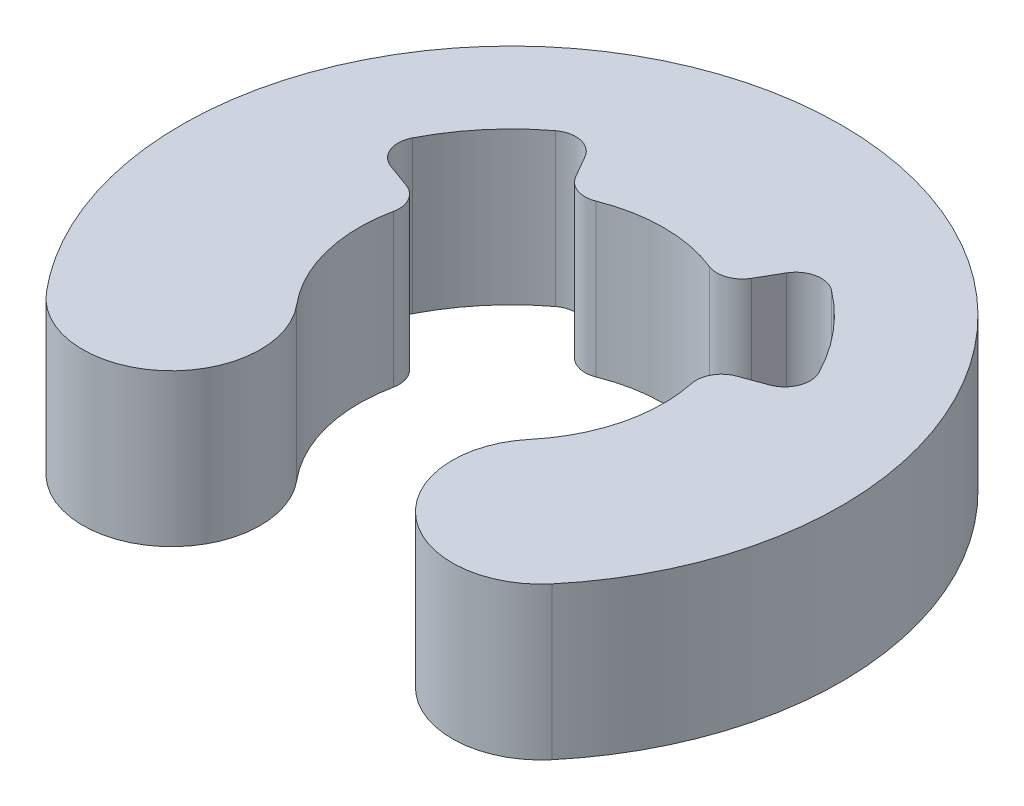
ISO-10303-21;
HEADER;
FILE_DESCRIPTION(('STEP AP214'),'2;1');
FILE_NAME('part.step','',(''),(''),'','','');
FILE_SCHEMA(('AUTOMOTIVE_DESIGN { 1 0 10303 214 1 1 1 1 }'));
ENDSEC;
DATA;
#1=APPLICATION_CONTEXT('core data for automotive mechanical design processes');
#2=APPLICATION_PROTOCOL_DEFINITION('international standard','automotive_design',2000,#1);
#3=PRODUCT_CONTEXT('',#1,'mechanical');
#4=PRODUCT('Part','Part','',(#3));
#5=PRODUCT_RELATED_PRODUCT_CATEGORY('part','',(#4));
#6=PRODUCT_DEFINITION_FORMATION('','',#4);
#7=PRODUCT_DEFINITION_CONTEXT('part definition',#1,'design');
#8=PRODUCT_DEFINITION('design','',#6,#7);
#9=PRODUCT_DEFINITION_SHAPE('','',#8);
#10=(LENGTH_UNIT() NAMED_UNIT(*) SI_UNIT(.MILLI.,.METRE.));
#11=(NAMED_UNIT(*) PLANE_ANGLE_UNIT() SI_UNIT($,.RADIAN.));
#12=(NAMED_UNIT(*) SI_UNIT($,.STERADIAN.) SOLID_ANGLE_UNIT());
#13=UNCERTAINTY_MEASURE_WITH_UNIT(LENGTH_MEASURE(1.E-05),#10,'distance_accuracy_value','');
#14=(GEOMETRIC_REPRESENTATION_CONTEXT(3) GLOBAL_UNCERTAINTY_ASSIGNED_CONTEXT((#13)) GLOBAL_UNIT_ASSIGNED_CONTEXT((#10,
#11,#12)) REPRESENTATION_CONTEXT('',''));
#15=CARTESIAN_POINT('',(0.,0.,0.));
#16=DIRECTION('',(0.,0.,1.));
#17=DIRECTION('',(1.,0.,0.));
#18=AXIS2_PLACEMENT_3D('',#15,#16,#17);
#19=CARTESIAN_POINT('',(3.42620079706036,3.,-0.714946220511138));
#20=DIRECTION('',(0.,-1.,0.));
#21=DIRECTION('',(0.,0.,-1.));
#22=AXIS2_PLACEMENT_3D('',#19,#20,#21);
#23=CYLINDRICAL_SURFACE('',#22,0.5);
#24=CARTESIAN_POINT('',(3.42620079706036,0.,-0.714946220511138));
#25=DIRECTION('',(0.,1.,0.));
#26=DIRECTION('',(0.,0.,1.));
#27=AXIS2_PLACEMENT_3D('',#24,#25,#26);
#28=CIRCLE('',#27,0.5);
#29=CARTESIAN_POINT('',(3.25519072539752,0.,-1.18479253090409));
#30=VERTEX_POINT('',#29);
#31=CARTESIAN_POINT('',(2.93674354033744,0.,-0.612811046152402));
#32=VERTEX_POINT('',#31);
#33=EDGE_CURVE('E211',#30,#32,#28,.T.);
#34=ORIENTED_EDGE('',*,*,#33,.T.);
#35=DIRECTION('',(0.,-1.,0.));
#36=VECTOR('',#35,1.);
#37=CARTESIAN_POINT('',(2.93674354033744,3.,-0.612811046152402));
#38=LINE('',#37,#36);
#39=CARTESIAN_POINT('',(2.93674354033744,3.,-0.612811046152402));
#40=VERTEX_POINT('',#39);
#41=EDGE_CURVE('E11',#40,#32,#38,.T.);
#42=ORIENTED_EDGE('',*,*,#41,.F.);
#43=CARTESIAN_POINT('',(3.42620079706036,3.,-0.714946220511138));
#44=DIRECTION('',(0.,1.,0.));
#45=DIRECTION('',(0.,0.,1.));
#46=AXIS2_PLACEMENT_3D('',#43,#44,#45);
#47=CIRCLE('',#46,0.5);
#48=CARTESIAN_POINT('',(3.25519072539752,3.,-1.18479253090409));
#49=VERTEX_POINT('',#48);
#50=EDGE_CURVE('E249',#49,#40,#47,.T.);
#51=ORIENTED_EDGE('',*,*,#50,.F.);
#52=DIRECTION('',(0.,-1.,0.));
#53=VECTOR('',#52,1.);
#54=CARTESIAN_POINT('',(3.25519072539752,3.,-1.18479253090409));
#55=LINE('',#54,#53);
#56=EDGE_CURVE('E207',#49,#30,#55,.T.);
#57=ORIENTED_EDGE('',*,*,#56,.T.);
#58=EDGE_LOOP('',(#34,#42,#51,#57));
#59=FACE_BOUND('',#58,.T.);
#60=ADVANCED_FACE('F43',(#59),#23,.T.);
#61=CARTESIAN_POINT('',(0.,3.,0.));
#62=DIRECTION('',(0.,-1.,0.));
#63=DIRECTION('',(0.,0.,-1.));
#64=AXIS2_PLACEMENT_3D('',#61,#62,#63);
#65=CYLINDRICAL_SURFACE('',#64,3.00000000000001);
#66=CARTESIAN_POINT('',(0.,0.,0.));
#67=DIRECTION('',(0.,-1.,0.));
#68=DIRECTION('',(0.,0.,1.));
#69=AXIS2_PLACEMENT_3D('',#66,#67,#68);
#70=CIRCLE('',#69,3.00000000000001);
#71=CARTESIAN_POINT('',(2.29813332935692,0.,1.92836282905963));
#72=VERTEX_POINT('',#71);
#73=EDGE_CURVE('E214',#32,#72,#70,.T.);
#74=ORIENTED_EDGE('',*,*,#73,.T.);
#75=DIRECTION('',(0.,-1.,0.));
#76=VECTOR('',#75,1.);
#77=CARTESIAN_POINT('',(2.29813332935692,3.,1.92836282905963));
#78=LINE('',#77,#76);
#79=CARTESIAN_POINT('',(2.29813332935692,3.,1.92836282905963));
#80=VERTEX_POINT('',#79);
#81=EDGE_CURVE('E51',#80,#72,#78,.T.);
#82=ORIENTED_EDGE('',*,*,#81,.F.);
#83=CARTESIAN_POINT('',(0.,3.,0.));
#84=DIRECTION('',(0.,-1.,0.));
#85=DIRECTION('',(0.,0.,1.));
#86=AXIS2_PLACEMENT_3D('',#83,#84,#85);
#87=CIRCLE('',#86,3.00000000000001);
#88=EDGE_CURVE('E138',#40,#80,#87,.T.);
#89=ORIENTED_EDGE('',*,*,#88,.F.);
#90=ORIENTED_EDGE('',*,*,#41,.T.);
#91=EDGE_LOOP('',(#74,#82,#89,#90));
#92=FACE_BOUND('',#91,.T.);
#93=ADVANCED_FACE('F367',(#92),#65,.F.);
#94=CARTESIAN_POINT('',(3.63871110481513,3.,3.05324114601108));
#95=DIRECTION('',(0.,-1.,0.));
#96=DIRECTION('',(0.,0.,-1.));
#97=AXIS2_PLACEMENT_3D('',#94,#95,#96);
#98=CYLINDRICAL_SURFACE('',#97,1.75);
#99=CARTESIAN_POINT('',(3.63871110481513,0.,3.05324114601108));
#100=DIRECTION('',(0.,1.,0.));
#101=DIRECTION('',(0.,0.,-1.));
#102=AXIS2_PLACEMENT_3D('',#99,#100,#101);
#103=CIRCLE('',#102,1.75);
#104=CARTESIAN_POINT('',(4.97928888027333,0.,4.17811946296253));
#105=VERTEX_POINT('',#104);
#106=EDGE_CURVE('E216',#72,#105,#103,.T.);
#107=ORIENTED_EDGE('',*,*,#106,.T.);
#108=DIRECTION('',(0.,-1.,0.));
#109=VECTOR('',#108,1.);
#110=CARTESIAN_POINT('',(4.97928888027333,3.,4.17811946296253));
#111=LINE('',#110,#109);
#112=CARTESIAN_POINT('',(4.97928888027333,3.,4.17811946296253));
#113=VERTEX_POINT('',#112);
#114=EDGE_CURVE('E292',#113,#105,#111,.T.);
#115=ORIENTED_EDGE('',*,*,#114,.F.);
#116=CARTESIAN_POINT('',(3.63871110481513,3.,3.05324114601108));
#117=DIRECTION('',(0.,1.,0.));
#118=DIRECTION('',(0.,0.,-1.));
#119=AXIS2_PLACEMENT_3D('',#116,#117,#118);
#120=CIRCLE('',#119,1.75);
#121=EDGE_CURVE('E300',#80,#113,#120,.T.);
#122=ORIENTED_EDGE('',*,*,#121,.F.);
#123=ORIENTED_EDGE('',*,*,#81,.T.);
#124=EDGE_LOOP('',(#107,#115,#122,#123));
#125=FACE_BOUND('',#124,.T.);
#126=ADVANCED_FACE('F298',(#125),#98,.T.);
#127=CARTESIAN_POINT('',(0.,3.,0.));
#128=DIRECTION('',(0.,-1.,0.));
#129=DIRECTION('',(0.,0.,-1.));
#130=AXIS2_PLACEMENT_3D('',#127,#128,#129);
#131=CYLINDRICAL_SURFACE('',#130,6.5);
#132=CARTESIAN_POINT('',(0.,0.,0.));
#133=DIRECTION('',(0.,1.,0.));
#134=DIRECTION('',(0.,0.,1.));
#135=AXIS2_PLACEMENT_3D('',#132,#133,#134);
#136=CIRCLE('',#135,6.5);
#137=CARTESIAN_POINT('',(-4.97928888027333,0.,4.17811946296253));
#138=VERTEX_POINT('',#137);
#139=EDGE_CURVE('E218',#105,#138,#136,.T.);
#140=ORIENTED_EDGE('',*,*,#139,.T.);
#141=DIRECTION('',(0.,-1.,0.));
#142=VECTOR('',#141,1.);
#143=CARTESIAN_POINT('',(-4.97928888027333,3.,4.17811946296253));
#144=LINE('',#143,#142);
#145=CARTESIAN_POINT('',(-4.97928888027333,3.,4.17811946296253));
#146=VERTEX_POINT('',#145);
#147=EDGE_CURVE('E289',#146,#138,#144,.T.);
#148=ORIENTED_EDGE('',*,*,#147,.F.);
#149=CARTESIAN_POINT('',(0.,3.,0.));
#150=DIRECTION('',(0.,1.,0.));
#151=DIRECTION('',(0.,0.,1.));
#152=AXIS2_PLACEMENT_3D('',#149,#150,#151);
#153=CIRCLE('',#152,6.5);
#154=EDGE_CURVE('E318',#113,#146,#153,.T.);
#155=ORIENTED_EDGE('',*,*,#154,.F.);
#156=ORIENTED_EDGE('',*,*,#114,.T.);
#157=EDGE_LOOP('',(#140,#148,#155,#156));
#158=FACE_BOUND('',#157,.T.);
#159=ADVANCED_FACE('F309',(#158),#131,.T.);
#160=CARTESIAN_POINT('',(-3.63871110481513,3.,3.05324114601108));
#161=DIRECTION('',(0.,-1.,0.));
#162=DIRECTION('',(0.,0.,-1.));
#163=AXIS2_PLACEMENT_3D('',#160,#161,#162);
#164=CYLINDRICAL_SURFACE('',#163,1.75);
#165=CARTESIAN_POINT('',(-3.63871110481513,0.,3.05324114601108));
#166=DIRECTION('',(0.,1.,0.));
#167=DIRECTION('',(0.,0.,1.));
#168=AXIS2_PLACEMENT_3D('',#165,#166,#167);
#169=CIRCLE('',#168,1.75);
#170=CARTESIAN_POINT('',(-2.29813332935693,0.,1.92836282905964));
#171=VERTEX_POINT('',#170);
#172=EDGE_CURVE('E220',#138,#171,#169,.T.);
#173=ORIENTED_EDGE('',*,*,#172,.T.);
#174=DIRECTION('',(0.,-1.,0.));
#175=VECTOR('',#174,1.);
#176=CARTESIAN_POINT('',(-2.29813332935693,3.,1.92836282905964));
#177=LINE('',#176,#175);
#178=CARTESIAN_POINT('',(-2.29813332935693,3.,1.92836282905964));
#179=VERTEX_POINT('',#178);
#180=EDGE_CURVE('E286',#179,#171,#177,.T.);
#181=ORIENTED_EDGE('',*,*,#180,.F.);
#182=CARTESIAN_POINT('',(-3.63871110481513,3.,3.05324114601108));
#183=DIRECTION('',(0.,1.,0.));
#184=DIRECTION('',(0.,0.,1.));
#185=AXIS2_PLACEMENT_3D('',#182,#183,#184);
#186=CIRCLE('',#185,1.75);
#187=EDGE_CURVE('E315',#146,#179,#186,.T.);
#188=ORIENTED_EDGE('',*,*,#187,.F.);
#189=ORIENTED_EDGE('',*,*,#147,.T.);
#190=EDGE_LOOP('',(#173,#181,#188,#189));
#191=FACE_BOUND('',#190,.T.);
#192=ADVANCED_FACE('F313',(#191),#164,.T.);
#193=CARTESIAN_POINT('',(0.,3.,0.));
#194=DIRECTION('',(0.,-1.,0.));
#195=DIRECTION('',(0.,0.,-1.));
#196=AXIS2_PLACEMENT_3D('',#193,#194,#195);
#197=CYLINDRICAL_SURFACE('',#196,3.00000000000001);
#198=CARTESIAN_POINT('',(0.,0.,0.));
#199=DIRECTION('',(0.,-1.,0.));
#200=DIRECTION('',(0.,0.,1.));
#201=AXIS2_PLACEMENT_3D('',#198,#199,#200);
#202=CIRCLE('',#201,3.00000000000001);
#203=CARTESIAN_POINT('',(-2.93674354033745,0.,-0.612811046152405));
#204=VERTEX_POINT('',#203);
#205=EDGE_CURVE('E222',#171,#204,#202,.T.);
#206=ORIENTED_EDGE('',*,*,#205,.T.);
#207=DIRECTION('',(0.,-1.,0.));
#208=VECTOR('',#207,1.);
#209=CARTESIAN_POINT('',(-2.93674354033745,3.,-0.612811046152405));
#210=LINE('',#209,#208);
#211=CARTESIAN_POINT('',(-2.93674354033745,3.,-0.612811046152405));
#212=VERTEX_POINT('',#211);
#213=EDGE_CURVE('E283',#212,#204,#210,.T.);
#214=ORIENTED_EDGE('',*,*,#213,.F.);
#215=CARTESIAN_POINT('',(0.,3.,0.));
#216=DIRECTION('',(0.,-1.,0.));
#217=DIRECTION('',(0.,0.,1.));
#218=AXIS2_PLACEMENT_3D('',#215,#216,#217);
#219=CIRCLE('',#218,3.00000000000001);
#220=EDGE_CURVE('E317',#179,#212,#219,.T.);
#221=ORIENTED_EDGE('',*,*,#220,.F.);
#222=ORIENTED_EDGE('',*,*,#180,.T.);
#223=EDGE_LOOP('',(#206,#214,#221,#222));
#224=FACE_BOUND('',#223,.T.);
#225=ADVANCED_FACE('F380',(#224),#197,.F.);
#226=CARTESIAN_POINT('',(-3.42620079706036,3.,-0.714946220511138));
#227=DIRECTION('',(0.,-1.,0.));
#228=DIRECTION('',(0.,0.,-1.));
#229=AXIS2_PLACEMENT_3D('',#226,#227,#228);
#230=CYLINDRICAL_SURFACE('',#229,0.5);
#231=CARTESIAN_POINT('',(-3.42620079706036,0.,-0.714946220511138));
#232=DIRECTION('',(0.,1.,0.));
#233=DIRECTION('',(0.,0.,-1.));
#234=AXIS2_PLACEMENT_3D('',#231,#232,#233);
#235=CIRCLE('',#234,0.5);
#236=CARTESIAN_POINT('',(-3.25519072539752,0.,-1.18479253090409));
#237=VERTEX_POINT('',#236);
#238=EDGE_CURVE('E224',#204,#237,#235,.T.);
#239=ORIENTED_EDGE('',*,*,#238,.T.);
#240=DIRECTION('',(0.,-1.,0.));
#241=VECTOR('',#240,1.);
#242=CARTESIAN_POINT('',(-3.25519072539752,3.,-1.18479253090409));
#243=LINE('',#242,#241);
#244=CARTESIAN_POINT('',(-3.25519072539752,3.,-1.18479253090409));
#245=VERTEX_POINT('',#244);
#246=EDGE_CURVE('E280',#245,#237,#243,.T.);
#247=ORIENTED_EDGE('',*,*,#246,.F.);
#248=CARTESIAN_POINT('',(-3.42620079706036,3.,-0.714946220511138));
#249=DIRECTION('',(0.,1.,0.));
#250=DIRECTION('',(0.,0.,-1.));
#251=AXIS2_PLACEMENT_3D('',#248,#249,#250);
#252=CIRCLE('',#251,0.5);
#253=EDGE_CURVE('E320',#212,#245,#252,.T.);
#254=ORIENTED_EDGE('',*,*,#253,.F.);
#255=ORIENTED_EDGE('',*,*,#213,.T.);
#256=EDGE_LOOP('',(#239,#247,#254,#255));
#257=FACE_BOUND('',#256,.T.);
#258=ADVANCED_FACE('F383',(#257),#230,.T.);
#259=CARTESIAN_POINT('',(-3.72928947516306,3.,-1.35735036392157));
#260=DIRECTION('',(-0.342020143325665,0.,0.93969262078591));
#261=DIRECTION('',(0.93969262078591,0.,0.342020143325665));
#262=AXIS2_PLACEMENT_3D('',#259,#260,#261);
#263=PLANE('',#262);
#264=DIRECTION('',(-0.93969262078591,0.,-0.342020143325665));
#265=VECTOR('',#264,1.);
#266=CARTESIAN_POINT('',(-3.72928947516306,0.,-1.35735036392157));
#267=LINE('',#266,#265);
#268=CARTESIAN_POINT('',(-3.72928947516306,0.,-1.35735036392157));
#269=VERTEX_POINT('',#268);
#270=EDGE_CURVE('E226',#237,#269,#267,.T.);
#271=ORIENTED_EDGE('',*,*,#270,.T.);
#272=DIRECTION('',(0.,-1.,0.));
#273=VECTOR('',#272,1.);
#274=CARTESIAN_POINT('',(-3.72928947516306,3.,-1.35735036392157));
#275=LINE('',#274,#273);
#276=CARTESIAN_POINT('',(-3.72928947516306,3.,-1.35735036392157));
#277=VERTEX_POINT('',#276);
#278=EDGE_CURVE('E277',#277,#269,#275,.T.);
#279=ORIENTED_EDGE('',*,*,#278,.F.);
#280=DIRECTION('',(-0.93969262078591,0.,-0.342020143325665));
#281=VECTOR('',#280,1.);
#282=CARTESIAN_POINT('',(-3.72928947516306,3.,-1.35735036392157));
#283=LINE('',#282,#281);
#284=EDGE_CURVE('E326',#245,#277,#283,.T.);
#285=ORIENTED_EDGE('',*,*,#284,.F.);
#286=ORIENTED_EDGE('',*,*,#246,.T.);
#287=EDGE_LOOP('',(#271,#279,#285,#286));
#288=FACE_BOUND('',#287,.T.);
#289=ADVANCED_FACE('F387',(#288),#263,.F.);
#290=CARTESIAN_POINT('',(-3.55827940350023,3.,-1.82719667431452));
#291=DIRECTION('',(0.,-1.,0.));
#292=DIRECTION('',(0.,0.,-1.));
#293=AXIS2_PLACEMENT_3D('',#290,#291,#292);
#294=CYLINDRICAL_SURFACE('',#293,0.5);
#295=CARTESIAN_POINT('',(-3.55827940350023,0.,-1.82719667431452));
#296=DIRECTION('',(0.,-1.,0.));
#297=DIRECTION('',(0.,0.,1.));
#298=AXIS2_PLACEMENT_3D('',#295,#296,#297);
#299=CIRCLE('',#298,0.5);
#300=CARTESIAN_POINT('',(-4.00306432893776,0.,-2.05559625860384));
#301=VERTEX_POINT('',#300);
#302=EDGE_CURVE('E228',#269,#301,#299,.T.);
#303=ORIENTED_EDGE('',*,*,#302,.T.);
#304=DIRECTION('',(0.,-1.,0.));
#305=VECTOR('',#304,1.);
#306=CARTESIAN_POINT('',(-4.00306432893776,3.,-2.05559625860384));
#307=LINE('',#306,#305);
#308=CARTESIAN_POINT('',(-4.00306432893776,3.,-2.05559625860384));
#309=VERTEX_POINT('',#308);
#310=EDGE_CURVE('E274',#309,#301,#307,.T.);
#311=ORIENTED_EDGE('',*,*,#310,.F.);
#312=CARTESIAN_POINT('',(-3.55827940350023,3.,-1.82719667431452));
#313=DIRECTION('',(0.,-1.,0.));
#314=DIRECTION('',(0.,0.,1.));
#315=AXIS2_PLACEMENT_3D('',#312,#313,#314);
#316=CIRCLE('',#315,0.5);
#317=EDGE_CURVE('E328',#277,#309,#316,.T.);
#318=ORIENTED_EDGE('',*,*,#317,.F.);
#319=ORIENTED_EDGE('',*,*,#278,.T.);
#320=EDGE_LOOP('',(#303,#311,#318,#319));
#321=FACE_BOUND('',#320,.T.);
#322=ADVANCED_FACE('F391',(#321),#294,.F.);
#323=CARTESIAN_POINT('',(0.,3.,0.));
#324=DIRECTION('',(0.,-1.,0.));
#325=DIRECTION('',(0.,0.,-1.));
#326=AXIS2_PLACEMENT_3D('',#323,#324,#325);
#327=CYLINDRICAL_SURFACE('',#326,4.5);
#328=CARTESIAN_POINT('',(0.,0.,0.));
#329=DIRECTION('',(0.,-1.,0.));
#330=DIRECTION('',(0.,0.,1.));
#331=AXIS2_PLACEMENT_3D('',#328,#329,#330);
#332=CIRCLE('',#331,4.5);
#333=CARTESIAN_POINT('',(-2.7194919583395,0.,-3.58529824261899));
#334=VERTEX_POINT('',#333);
#335=EDGE_CURVE('E230',#301,#334,#332,.T.);
#336=ORIENTED_EDGE('',*,*,#335,.T.);
#337=DIRECTION('',(0.,-1.,0.));
#338=VECTOR('',#337,1.);
#339=CARTESIAN_POINT('',(-2.7194919583395,3.,-3.58529824261899));
#340=LINE('',#339,#338);
#341=CARTESIAN_POINT('',(-2.7194919583395,3.,-3.58529824261899));
#342=VERTEX_POINT('',#341);
#343=EDGE_CURVE('E271',#342,#334,#340,.T.);
#344=ORIENTED_EDGE('',*,*,#343,.F.);
#345=CARTESIAN_POINT('',(0.,3.,0.));
#346=DIRECTION('',(0.,-1.,0.));
#347=DIRECTION('',(0.,0.,1.));
#348=AXIS2_PLACEMENT_3D('',#345,#346,#347);
#349=CIRCLE('',#348,4.5);
#350=EDGE_CURVE('E330',#309,#342,#349,.T.);
#351=ORIENTED_EDGE('',*,*,#350,.F.);
#352=ORIENTED_EDGE('',*,*,#310,.T.);
#353=EDGE_LOOP('',(#336,#344,#351,#352));
#354=FACE_BOUND('',#353,.T.);
#355=ADVANCED_FACE('F395',(#354),#327,.F.);
#356=CARTESIAN_POINT('',(-2.41732618519067,3.,-3.18693177121688));
#357=DIRECTION('',(0.,-1.,0.));
#358=DIRECTION('',(0.,0.,-1.));
#359=AXIS2_PLACEMENT_3D('',#356,#357,#358);
#360=CYLINDRICAL_SURFACE('',#359,0.500000000000001);
#361=CARTESIAN_POINT('',(-2.41732618519067,0.,-3.18693177121688));
#362=DIRECTION('',(0.,-1.,0.));
#363=DIRECTION('',(0.,0.,-1.));
#364=AXIS2_PLACEMENT_3D('',#361,#362,#363);
#365=CIRCLE('',#364,0.500000000000001);
#366=CARTESIAN_POINT('',(-1.98431348329845,0.,-3.43693177121688));
#367=VERTEX_POINT('',#366);
#368=EDGE_CURVE('E232',#334,#367,#365,.T.);
#369=ORIENTED_EDGE('',*,*,#368,.T.);
#370=DIRECTION('',(0.,-1.,0.));
#371=VECTOR('',#370,1.);
#372=CARTESIAN_POINT('',(-1.98431348329845,3.,-3.43693177121688));
#373=LINE('',#372,#371);
#374=CARTESIAN_POINT('',(-1.98431348329845,3.,-3.43693177121688));
#375=VERTEX_POINT('',#374);
#376=EDGE_CURVE('E268',#375,#367,#373,.T.);
#377=ORIENTED_EDGE('',*,*,#376,.F.);
#378=CARTESIAN_POINT('',(-2.41732618519067,3.,-3.18693177121688));
#379=DIRECTION('',(0.,-1.,0.));
#380=DIRECTION('',(0.,0.,-1.));
#381=AXIS2_PLACEMENT_3D('',#378,#379,#380);
#382=CIRCLE('',#381,0.500000000000001);
#383=EDGE_CURVE('E332',#342,#375,#382,.T.);
#384=ORIENTED_EDGE('',*,*,#383,.F.);
#385=ORIENTED_EDGE('',*,*,#343,.T.);
#386=EDGE_LOOP('',(#369,#377,#384,#385));
#387=FACE_BOUND('',#386,.T.);
#388=ADVANCED_FACE('F399',(#387),#360,.F.);
#389=CARTESIAN_POINT('',(-1.98431348329845,3.,-3.43693177121688));
#390=DIRECTION('',(0.866025403784438,0.,-0.500000000000001));
#391=DIRECTION('',(-0.500000000000001,0.,-0.866025403784438));
#392=AXIS2_PLACEMENT_3D('',#389,#390,#391);
#393=PLANE('',#392);
#394=DIRECTION('',(0.500000000000001,0.,0.866025403784438));
#395=VECTOR('',#394,1.);
#396=CARTESIAN_POINT('',(-1.98431348329845,0.,-3.43693177121688));
#397=LINE('',#396,#395);
#398=CARTESIAN_POINT('',(-1.73205080756888,0.,-3.));
#399=VERTEX_POINT('',#398);
#400=EDGE_CURVE('E234',#367,#399,#397,.T.);
#401=ORIENTED_EDGE('',*,*,#400,.T.);
#402=DIRECTION('',(0.,-1.,0.));
#403=VECTOR('',#402,1.);
#404=CARTESIAN_POINT('',(-1.73205080756888,3.,-3.));
#405=LINE('',#404,#403);
#406=CARTESIAN_POINT('',(-1.73205080756888,3.,-3.));
#407=VERTEX_POINT('',#406);
#408=EDGE_CURVE('E265',#407,#399,#405,.T.);
#409=ORIENTED_EDGE('',*,*,#408,.F.);
#410=DIRECTION('',(0.500000000000001,0.,0.866025403784438));
#411=VECTOR('',#410,1.);
#412=CARTESIAN_POINT('',(-1.98431348329845,3.,-3.43693177121688));
#413=LINE('',#412,#411);
#414=EDGE_CURVE('E334',#375,#407,#413,.T.);
#415=ORIENTED_EDGE('',*,*,#414,.F.);
#416=ORIENTED_EDGE('',*,*,#376,.T.);
#417=EDGE_LOOP('',(#401,#409,#415,#416));
#418=FACE_BOUND('',#417,.T.);
#419=ADVANCED_FACE('F403',(#418),#393,.F.);
#420=CARTESIAN_POINT('',(-1.29903810567666,3.,-3.25));
#421=DIRECTION('',(0.,-1.,0.));
#422=DIRECTION('',(0.,0.,-1.));
#423=AXIS2_PLACEMENT_3D('',#420,#421,#422);
#424=CYLINDRICAL_SURFACE('',#423,0.5);
#425=CARTESIAN_POINT('',(-1.29903810567666,0.,-3.25));
#426=DIRECTION('',(0.,1.,0.));
#427=DIRECTION('',(0.,0.,1.));
#428=AXIS2_PLACEMENT_3D('',#425,#426,#427);
#429=CIRCLE('',#428,0.5);
#430=CARTESIAN_POINT('',(-1.11346123343714,0.,-2.7857142857143));
#431=VERTEX_POINT('',#430);
#432=EDGE_CURVE('E236',#399,#431,#429,.T.);
#433=ORIENTED_EDGE('',*,*,#432,.T.);
#434=DIRECTION('',(0.,-1.,0.));
#435=VECTOR('',#434,1.);
#436=CARTESIAN_POINT('',(-1.11346123343714,3.,-2.7857142857143));
#437=LINE('',#436,#435);
#438=CARTESIAN_POINT('',(-1.11346123343714,3.,-2.7857142857143));
#439=VERTEX_POINT('',#438);
#440=EDGE_CURVE('E262',#439,#431,#437,.T.);
#441=ORIENTED_EDGE('',*,*,#440,.F.);
#442=CARTESIAN_POINT('',(-1.29903810567666,3.,-3.25));
#443=DIRECTION('',(0.,1.,0.));
#444=DIRECTION('',(0.,0.,1.));
#445=AXIS2_PLACEMENT_3D('',#442,#443,#444);
#446=CIRCLE('',#445,0.5);
#447=EDGE_CURVE('E336',#407,#439,#446,.T.);
#448=ORIENTED_EDGE('',*,*,#447,.F.);
#449=ORIENTED_EDGE('',*,*,#408,.T.);
#450=EDGE_LOOP('',(#433,#441,#448,#449));
#451=FACE_BOUND('',#450,.T.);
#452=ADVANCED_FACE('F407',(#451),#424,.T.);
#453=CARTESIAN_POINT('',(0.,3.,0.));
#454=DIRECTION('',(0.,-1.,0.));
#455=DIRECTION('',(0.,0.,-1.));
#456=AXIS2_PLACEMENT_3D('',#453,#454,#455);
#457=CYLINDRICAL_SURFACE('',#456,3.00000000000001);
#458=CARTESIAN_POINT('',(0.,0.,0.));
#459=DIRECTION('',(0.,-1.,0.));
#460=DIRECTION('',(0.,0.,1.));
#461=AXIS2_PLACEMENT_3D('',#458,#459,#460);
#462=CIRCLE('',#461,3.00000000000001);
#463=CARTESIAN_POINT('',(1.11346123343715,0.,-2.78571428571431));
#464=VERTEX_POINT('',#463);
#465=EDGE_CURVE('E238',#431,#464,#462,.T.);
#466=ORIENTED_EDGE('',*,*,#465,.T.);
#467=DIRECTION('',(0.,-1.,0.));
#468=VECTOR('',#467,1.);
#469=CARTESIAN_POINT('',(1.11346123343715,3.,-2.78571428571431));
#470=LINE('',#469,#468);
#471=CARTESIAN_POINT('',(1.11346123343715,3.,-2.78571428571431));
#472=VERTEX_POINT('',#471);
#473=EDGE_CURVE('E259',#472,#464,#470,.T.);
#474=ORIENTED_EDGE('',*,*,#473,.F.);
#475=CARTESIAN_POINT('',(0.,3.,0.));
#476=DIRECTION('',(0.,-1.,0.));
#477=DIRECTION('',(0.,0.,1.));
#478=AXIS2_PLACEMENT_3D('',#475,#476,#477);
#479=CIRCLE('',#478,3.00000000000001);
#480=EDGE_CURVE('E338',#439,#472,#479,.T.);
#481=ORIENTED_EDGE('',*,*,#480,.F.);
#482=ORIENTED_EDGE('',*,*,#440,.T.);
#483=EDGE_LOOP('',(#466,#474,#481,#482));
#484=FACE_BOUND('',#483,.T.);
#485=ADVANCED_FACE('F411',(#484),#457,.F.);
#486=CARTESIAN_POINT('',(1.29903810567668,3.,-3.25000000000002));
#487=DIRECTION('',(0.,-1.,0.));
#488=DIRECTION('',(0.,0.,-1.));
#489=AXIS2_PLACEMENT_3D('',#486,#487,#488);
#490=CYLINDRICAL_SURFACE('',#489,0.5);
#491=CARTESIAN_POINT('',(1.29903810567668,0.,-3.25000000000002));
#492=DIRECTION('',(0.,1.,0.));
#493=DIRECTION('',(0.,0.,-1.));
#494=AXIS2_PLACEMENT_3D('',#491,#492,#493);
#495=CIRCLE('',#494,0.5);
#496=CARTESIAN_POINT('',(1.7320508075689,0.,-3.00000000000002));
#497=VERTEX_POINT('',#496);
#498=EDGE_CURVE('E240',#464,#497,#495,.T.);
#499=ORIENTED_EDGE('',*,*,#498,.T.);
#500=DIRECTION('',(0.,-1.,0.));
#501=VECTOR('',#500,1.);
#502=CARTESIAN_POINT('',(1.7320508075689,3.,-3.00000000000002));
#503=LINE('',#502,#501);
#504=CARTESIAN_POINT('',(1.7320508075689,3.,-3.00000000000002));
#505=VERTEX_POINT('',#504);
#506=EDGE_CURVE('E256',#505,#497,#503,.T.);
#507=ORIENTED_EDGE('',*,*,#506,.F.);
#508=CARTESIAN_POINT('',(1.29903810567668,3.,-3.25000000000002));
#509=DIRECTION('',(0.,1.,0.));
#510=DIRECTION('',(0.,0.,-1.));
#511=AXIS2_PLACEMENT_3D('',#508,#509,#510);
#512=CIRCLE('',#511,0.5);
#513=EDGE_CURVE('E340',#472,#505,#512,.T.);
#514=ORIENTED_EDGE('',*,*,#513,.F.);
#515=ORIENTED_EDGE('',*,*,#473,.T.);
#516=EDGE_LOOP('',(#499,#507,#514,#515));
#517=FACE_BOUND('',#516,.T.);
#518=ADVANCED_FACE('F415',(#517),#490,.T.);
#519=CARTESIAN_POINT('',(1.98431348329845,3.,-3.43693177121688));
#520=DIRECTION('',(-0.866025403784438,0.,-0.500000000000001));
#521=DIRECTION('',(-0.500000000000001,0.,0.866025403784438));
#522=AXIS2_PLACEMENT_3D('',#519,#520,#521);
#523=PLANE('',#522);
#524=DIRECTION('',(0.500000000000001,0.,-0.866025403784438));
#525=VECTOR('',#524,1.);
#526=CARTESIAN_POINT('',(1.98431348329845,0.,-3.43693177121688));
#527=LINE('',#526,#525);
#528=CARTESIAN_POINT('',(1.98431348329845,0.,-3.43693177121688));
#529=VERTEX_POINT('',#528);
#530=EDGE_CURVE('E242',#497,#529,#527,.T.);
#531=ORIENTED_EDGE('',*,*,#530,.T.);
#532=DIRECTION('',(0.,-1.,0.));
#533=VECTOR('',#532,1.);
#534=CARTESIAN_POINT('',(1.98431348329845,3.,-3.43693177121688));
#535=LINE('',#534,#533);
#536=CARTESIAN_POINT('',(1.98431348329845,3.,-3.43693177121688));
#537=VERTEX_POINT('',#536);
#538=EDGE_CURVE('E253',#537,#529,#535,.T.);
#539=ORIENTED_EDGE('',*,*,#538,.F.);
#540=DIRECTION('',(0.500000000000001,0.,-0.866025403784438));
#541=VECTOR('',#540,1.);
#542=CARTESIAN_POINT('',(1.98431348329845,3.,-3.43693177121688));
#543=LINE('',#542,#541);
#544=EDGE_CURVE('E342',#505,#537,#543,.T.);
#545=ORIENTED_EDGE('',*,*,#544,.F.);
#546=ORIENTED_EDGE('',*,*,#506,.T.);
#547=EDGE_LOOP('',(#531,#539,#545,#546));
#548=FACE_BOUND('',#547,.T.);
#549=ADVANCED_FACE('F348',(#548),#523,.F.);
#550=CARTESIAN_POINT('',(2.41732618519067,3.,-3.18693177121688));
#551=DIRECTION('',(0.,-1.,0.));
#552=DIRECTION('',(0.,0.,-1.));
#553=AXIS2_PLACEMENT_3D('',#550,#551,#552);
#554=CYLINDRICAL_SURFACE('',#553,0.5);
#555=CARTESIAN_POINT('',(2.41732618519067,0.,-3.18693177121688));
#556=DIRECTION('',(0.,-1.,0.));
#557=DIRECTION('',(0.,0.,1.));
#558=AXIS2_PLACEMENT_3D('',#555,#556,#557);
#559=CIRCLE('',#558,0.5);
#560=CARTESIAN_POINT('',(2.7194919583395,0.,-3.58529824261899));
#561=VERTEX_POINT('',#560);
#562=EDGE_CURVE('E244',#529,#561,#559,.T.);
#563=ORIENTED_EDGE('',*,*,#562,.T.);
#564=DIRECTION('',(0.,-1.,0.));
#565=VECTOR('',#564,1.);
#566=CARTESIAN_POINT('',(2.7194919583395,3.,-3.58529824261899));
#567=LINE('',#566,#565);
#568=CARTESIAN_POINT('',(2.7194919583395,3.,-3.58529824261899));
#569=VERTEX_POINT('',#568);
#570=EDGE_CURVE('E202',#569,#561,#567,.T.);
#571=ORIENTED_EDGE('',*,*,#570,.F.);
#572=CARTESIAN_POINT('',(2.41732618519067,3.,-3.18693177121688));
#573=DIRECTION('',(0.,-1.,0.));
#574=DIRECTION('',(0.,0.,1.));
#575=AXIS2_PLACEMENT_3D('',#572,#573,#574);
#576=CIRCLE('',#575,0.5);
#577=EDGE_CURVE('E193',#537,#569,#576,.T.);
#578=ORIENTED_EDGE('',*,*,#577,.F.);
#579=ORIENTED_EDGE('',*,*,#538,.T.);
#580=EDGE_LOOP('',(#563,#571,#578,#579));
#581=FACE_BOUND('',#580,.T.);
#582=ADVANCED_FACE('F352',(#581),#554,.F.);
#583=CARTESIAN_POINT('',(0.,3.,0.));
#584=DIRECTION('',(0.,-1.,0.));
#585=DIRECTION('',(0.,0.,-1.));
#586=AXIS2_PLACEMENT_3D('',#583,#584,#585);
#587=CYLINDRICAL_SURFACE('',#586,4.5);
#588=CARTESIAN_POINT('',(0.,0.,0.));
#589=DIRECTION('',(0.,-1.,0.));
#590=DIRECTION('',(0.,0.,1.));
#591=AXIS2_PLACEMENT_3D('',#588,#589,#590);
#592=CIRCLE('',#591,4.5);
#593=CARTESIAN_POINT('',(4.00306432893776,0.,-2.05559625860384));
#594=VERTEX_POINT('',#593);
#595=EDGE_CURVE('E201',#561,#594,#592,.T.);
#596=ORIENTED_EDGE('',*,*,#595,.T.);
#597=DIRECTION('',(0.,-1.,0.));
#598=VECTOR('',#597,1.);
#599=CARTESIAN_POINT('',(4.00306432893776,3.,-2.05559625860384));
#600=LINE('',#599,#598);
#601=CARTESIAN_POINT('',(4.00306432893776,3.,-2.05559625860384));
#602=VERTEX_POINT('',#601);
#603=EDGE_CURVE('E198',#602,#594,#600,.T.);
#604=ORIENTED_EDGE('',*,*,#603,.F.);
#605=CARTESIAN_POINT('',(0.,3.,0.));
#606=DIRECTION('',(0.,-1.,0.));
#607=DIRECTION('',(0.,0.,1.));
#608=AXIS2_PLACEMENT_3D('',#605,#606,#607);
#609=CIRCLE('',#608,4.5);
#610=EDGE_CURVE('E187',#569,#602,#609,.T.);
#611=ORIENTED_EDGE('',*,*,#610,.F.);
#612=ORIENTED_EDGE('',*,*,#570,.T.);
#613=EDGE_LOOP('',(#596,#604,#611,#612));
#614=FACE_BOUND('',#613,.T.);
#615=ADVANCED_FACE('F199',(#614),#587,.F.);
#616=CARTESIAN_POINT('',(3.55827940350023,3.,-1.82719667431452));
#617=DIRECTION('',(0.,-1.,0.));
#618=DIRECTION('',(0.,0.,-1.));
#619=AXIS2_PLACEMENT_3D('',#616,#617,#618);
#620=CYLINDRICAL_SURFACE('',#619,0.5);
#621=CARTESIAN_POINT('',(3.55827940350023,0.,-1.82719667431452));
#622=DIRECTION('',(0.,-1.,0.));
#623=DIRECTION('',(0.,0.,-1.));
#624=AXIS2_PLACEMENT_3D('',#621,#622,#623);
#625=CIRCLE('',#624,0.5);
#626=CARTESIAN_POINT('',(3.72928947516306,0.,-1.35735036392157));
#627=VERTEX_POINT('',#626);
#628=EDGE_CURVE('E124',#594,#627,#625,.T.);
#629=ORIENTED_EDGE('',*,*,#628,.T.);
#630=DIRECTION('',(0.,-1.,0.));
#631=VECTOR('',#630,1.);
#632=CARTESIAN_POINT('',(3.72928947516306,3.,-1.35735036392157));
#633=LINE('',#632,#631);
#634=CARTESIAN_POINT('',(3.72928947516306,3.,-1.35735036392157));
#635=VERTEX_POINT('',#634);
#636=EDGE_CURVE('E203',#635,#627,#633,.T.);
#637=ORIENTED_EDGE('',*,*,#636,.F.);
#638=CARTESIAN_POINT('',(3.55827940350023,3.,-1.82719667431452));
#639=DIRECTION('',(0.,-1.,0.));
#640=DIRECTION('',(0.,0.,-1.));
#641=AXIS2_PLACEMENT_3D('',#638,#639,#640);
#642=CIRCLE('',#641,0.5);
#643=EDGE_CURVE('E191',#602,#635,#642,.T.);
#644=ORIENTED_EDGE('',*,*,#643,.F.);
#645=ORIENTED_EDGE('',*,*,#603,.T.);
#646=EDGE_LOOP('',(#629,#637,#644,#645));
#647=FACE_BOUND('',#646,.T.);
#648=ADVANCED_FACE('F205',(#647),#620,.F.);
#649=CARTESIAN_POINT('',(3.72928947516306,3.,-1.35735036392157));
#650=DIRECTION('',(0.342020143325665,0.,0.93969262078591));
#651=DIRECTION('',(0.93969262078591,0.,-0.342020143325665));
#652=AXIS2_PLACEMENT_3D('',#649,#650,#651);
#653=PLANE('',#652);
#654=DIRECTION('',(-0.93969262078591,0.,0.342020143325665));
#655=VECTOR('',#654,1.);
#656=CARTESIAN_POINT('',(3.72928947516306,0.,-1.35735036392157));
#657=LINE('',#656,#655);
#658=EDGE_CURVE('E130',#627,#30,#657,.T.);
#659=ORIENTED_EDGE('',*,*,#658,.T.);
#660=ORIENTED_EDGE('',*,*,#56,.F.);
#661=DIRECTION('',(-0.93969262078591,0.,0.342020143325665));
#662=VECTOR('',#661,1.);
#663=CARTESIAN_POINT('',(3.72928947516306,3.,-1.35735036392157));
#664=LINE('',#663,#662);
#665=EDGE_CURVE('E59',#635,#49,#664,.T.);
#666=ORIENTED_EDGE('',*,*,#665,.F.);
#667=ORIENTED_EDGE('',*,*,#636,.T.);
#668=EDGE_LOOP('',(#659,#660,#666,#667));
#669=FACE_BOUND('',#668,.T.);
#670=ADVANCED_FACE('F356',(#669),#653,.F.);
#671=CARTESIAN_POINT('',(3.42620079706036,3.,-0.714946220511138));
#672=DIRECTION('',(0.,1.,0.));
#673=DIRECTION('',(0.,0.,1.));
#674=AXIS2_PLACEMENT_3D('',#671,#672,#673);
#675=PLANE('',#674);
#676=ORIENTED_EDGE('',*,*,#50,.T.);
#677=ORIENTED_EDGE('',*,*,#88,.T.);
#678=ORIENTED_EDGE('',*,*,#121,.T.);
#679=ORIENTED_EDGE('',*,*,#154,.T.);
#680=ORIENTED_EDGE('',*,*,#187,.T.);
#681=ORIENTED_EDGE('',*,*,#220,.T.);
#682=ORIENTED_EDGE('',*,*,#253,.T.);
#683=ORIENTED_EDGE('',*,*,#284,.T.);
#684=ORIENTED_EDGE('',*,*,#317,.T.);
#685=ORIENTED_EDGE('',*,*,#350,.T.);
#686=ORIENTED_EDGE('',*,*,#383,.T.);
#687=ORIENTED_EDGE('',*,*,#414,.T.);
#688=ORIENTED_EDGE('',*,*,#447,.T.);
#689=ORIENTED_EDGE('',*,*,#480,.T.);
#690=ORIENTED_EDGE('',*,*,#513,.T.);
#691=ORIENTED_EDGE('',*,*,#544,.T.);
#692=ORIENTED_EDGE('',*,*,#577,.T.);
#693=ORIENTED_EDGE('',*,*,#610,.T.);
#694=ORIENTED_EDGE('',*,*,#643,.T.);
#695=ORIENTED_EDGE('',*,*,#665,.T.);
#696=EDGE_LOOP('',(#676,#677,#678,#679,#680,#681,#682,#683,#684,#685,#686,#687,#688,#689,#690,
#691,#692,#693,#694,#695));
#697=FACE_BOUND('',#696,.T.);
#698=ADVANCED_FACE('F189',(#697),#675,.T.);
#699=CARTESIAN_POINT('',(3.42620079706036,0.,-0.714946220511138));
#700=DIRECTION('',(0.,1.,0.));
#701=DIRECTION('',(0.,0.,1.));
#702=AXIS2_PLACEMENT_3D('',#699,#700,#701);
#703=PLANE('',#702);
#704=ORIENTED_EDGE('',*,*,#33,.F.);
#705=ORIENTED_EDGE('',*,*,#658,.F.);
#706=ORIENTED_EDGE('',*,*,#628,.F.);
#707=ORIENTED_EDGE('',*,*,#595,.F.);
#708=ORIENTED_EDGE('',*,*,#562,.F.);
#709=ORIENTED_EDGE('',*,*,#530,.F.);
#710=ORIENTED_EDGE('',*,*,#498,.F.);
#711=ORIENTED_EDGE('',*,*,#465,.F.);
#712=ORIENTED_EDGE('',*,*,#432,.F.);
#713=ORIENTED_EDGE('',*,*,#400,.F.);
#714=ORIENTED_EDGE('',*,*,#368,.F.);
#715=ORIENTED_EDGE('',*,*,#335,.F.);
#716=ORIENTED_EDGE('',*,*,#302,.F.);
#717=ORIENTED_EDGE('',*,*,#270,.F.);
#718=ORIENTED_EDGE('',*,*,#238,.F.);
#719=ORIENTED_EDGE('',*,*,#205,.F.);
#720=ORIENTED_EDGE('',*,*,#172,.F.);
#721=ORIENTED_EDGE('',*,*,#139,.F.);
#722=ORIENTED_EDGE('',*,*,#106,.F.);
#723=ORIENTED_EDGE('',*,*,#73,.F.);
#724=EDGE_LOOP('',(#704,#705,#706,#707,#708,#709,#710,#711,#712,#713,#714,#715,#716,#717,#718,
#719,#720,#721,#722,#723));
#725=FACE_BOUND('',#724,.T.);
#726=ADVANCED_FACE('F304',(#725),#703,.F.);
#727=CLOSED_SHELL('',(#60,#93,#126,#159,#192,#225,#258,#289,#322,#355,#388,#419,#452,#485,#518,
#549,#582,#615,#648,#670,#698,#726));
#728=MANIFOLD_SOLID_BREP('B2',#727);
#729=ADVANCED_BREP_SHAPE_REPRESENTATION('',(#18,#728),#14);
#730=SHAPE_DEFINITION_REPRESENTATION(#9,#729);
ENDSEC;
END-ISO-10303-21;
